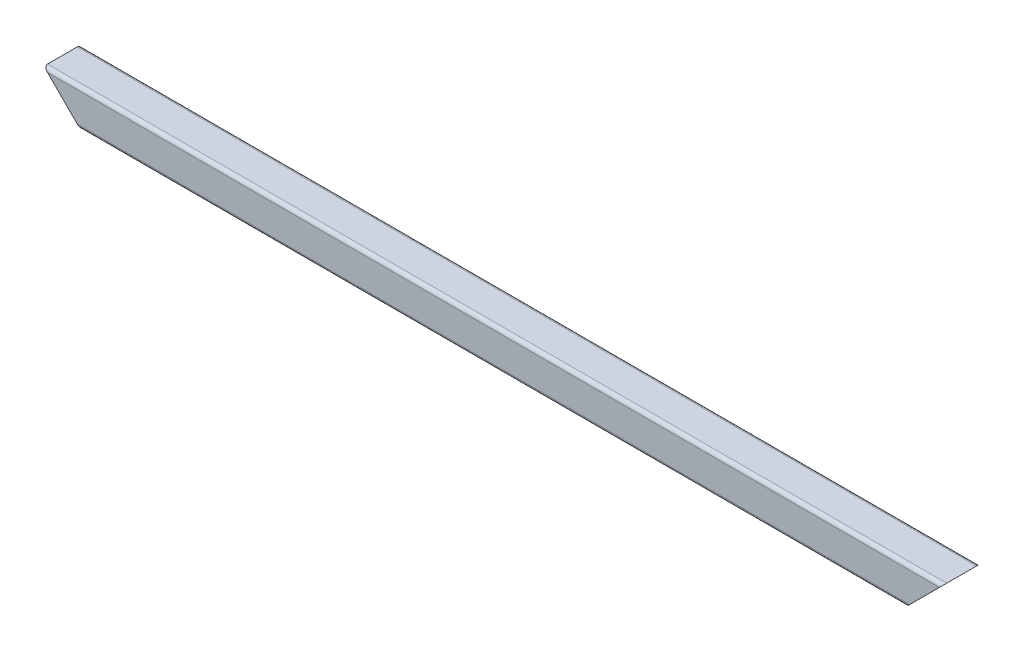
ISO-10303-21;
HEADER;
FILE_DESCRIPTION(('STEP AP214'),'2;1');
FILE_NAME('part.step','',(''),(''),'','','');
FILE_SCHEMA(('AUTOMOTIVE_DESIGN { 1 0 10303 214 1 1 1 1 }'));
ENDSEC;
DATA;
#1=APPLICATION_CONTEXT('core data for automotive mechanical design processes');
#2=APPLICATION_PROTOCOL_DEFINITION('international standard','automotive_design',2000,#1);
#3=PRODUCT_CONTEXT('',#1,'mechanical');
#4=PRODUCT('Part','Part','',(#3));
#5=PRODUCT_RELATED_PRODUCT_CATEGORY('part','',(#4));
#6=PRODUCT_DEFINITION_FORMATION('','',#4);
#7=PRODUCT_DEFINITION_CONTEXT('part definition',#1,'design');
#8=PRODUCT_DEFINITION('design','',#6,#7);
#9=PRODUCT_DEFINITION_SHAPE('','',#8);
#10=(LENGTH_UNIT() NAMED_UNIT(*) SI_UNIT(.MILLI.,.METRE.));
#11=(NAMED_UNIT(*) PLANE_ANGLE_UNIT() SI_UNIT($,.RADIAN.));
#12=(NAMED_UNIT(*) SI_UNIT($,.STERADIAN.) SOLID_ANGLE_UNIT());
#13=UNCERTAINTY_MEASURE_WITH_UNIT(LENGTH_MEASURE(1.E-05),#10,'distance_accuracy_value','');
#14=(GEOMETRIC_REPRESENTATION_CONTEXT(3) GLOBAL_UNCERTAINTY_ASSIGNED_CONTEXT((#13)) GLOBAL_UNIT_ASSIGNED_CONTEXT((#10,
#11,#12)) REPRESENTATION_CONTEXT('',''));
#15=CARTESIAN_POINT('',(0.,0.,0.));
#16=DIRECTION('',(0.,0.,1.));
#17=DIRECTION('',(1.,0.,0.));
#18=AXIS2_PLACEMENT_3D('',#15,#16,#17);
#19=CARTESIAN_POINT('',(-616.49,12.7,-12.7));
#20=DIRECTION('',(0.,0.,-1.));
#21=DIRECTION('',(0.,1.,0.));
#22=AXIS2_PLACEMENT_3D('',#19,#20,#21);
#23=PLANE('',#22);
#24=DIRECTION('',(-0.707106781186551,-0.707106781186544,0.));
#25=VECTOR('',#24,1.);
#26=CARTESIAN_POINT('',(0.,12.7,-12.7));
#27=LINE('',#26,#25);
#28=CARTESIAN_POINT('',(-2.50000000000005,10.2,-12.7));
#29=VERTEX_POINT('',#28);
#30=CARTESIAN_POINT('',(-22.9000000000002,-10.2,-12.7));
#31=VERTEX_POINT('',#30);
#32=EDGE_CURVE('E166',#29,#31,#27,.T.);
#33=ORIENTED_EDGE('',*,*,#32,.T.);
#34=DIRECTION('',(1.,0.,0.));
#35=VECTOR('',#34,1.);
#36=CARTESIAN_POINT('',(-616.49,-10.2,-12.7));
#37=LINE('',#36,#35);
#38=CARTESIAN_POINT('',(-593.59,-10.2,-12.7));
#39=VERTEX_POINT('',#38);
#40=EDGE_CURVE('E172',#31,#39,#37,.F.);
#41=ORIENTED_EDGE('',*,*,#40,.T.);
#42=DIRECTION('',(-0.707106781186552,0.707106781186543,0.));
#43=VECTOR('',#42,1.);
#44=CARTESIAN_POINT('',(-616.49,12.7,-12.7));
#45=LINE('',#44,#43);
#46=CARTESIAN_POINT('',(-613.99,10.2,-12.7));
#47=VERTEX_POINT('',#46);
#48=EDGE_CURVE('E276',#39,#47,#45,.T.);
#49=ORIENTED_EDGE('',*,*,#48,.T.);
#50=DIRECTION('',(1.,0.,0.));
#51=VECTOR('',#50,1.);
#52=CARTESIAN_POINT('',(-616.49,10.2,-12.7));
#53=LINE('',#52,#51);
#54=EDGE_CURVE('E179',#47,#29,#53,.T.);
#55=ORIENTED_EDGE('',*,*,#54,.T.);
#56=EDGE_LOOP('',(#33,#41,#49,#55));
#57=FACE_BOUND('',#56,.T.);
#58=ADVANCED_FACE('F37',(#57),#23,.T.);
#59=CARTESIAN_POINT('',(-616.49,-12.7,12.7));
#60=DIRECTION('',(0.,-1.,0.));
#61=DIRECTION('',(0.,0.,-1.));
#62=AXIS2_PLACEMENT_3D('',#59,#60,#61);
#63=PLANE('',#62);
#64=DIRECTION('',(0.,0.,1.));
#65=VECTOR('',#64,1.);
#66=CARTESIAN_POINT('',(-25.4000000000003,-12.7,-12.7));
#67=LINE('',#66,#65);
#68=CARTESIAN_POINT('',(-25.4000000000003,-12.7,-10.2));
#69=VERTEX_POINT('',#68);
#70=CARTESIAN_POINT('',(-25.4000000000003,-12.7,10.2));
#71=VERTEX_POINT('',#70);
#72=EDGE_CURVE('E302',#69,#71,#67,.T.);
#73=ORIENTED_EDGE('',*,*,#72,.T.);
#74=DIRECTION('',(1.,0.,0.));
#75=VECTOR('',#74,1.);
#76=CARTESIAN_POINT('',(-616.49,-12.7,10.2));
#77=LINE('',#76,#75);
#78=CARTESIAN_POINT('',(-591.09,-12.7,10.2));
#79=VERTEX_POINT('',#78);
#80=EDGE_CURVE('E261',#71,#79,#77,.F.);
#81=ORIENTED_EDGE('',*,*,#80,.T.);
#82=DIRECTION('',(0.,0.,1.));
#83=VECTOR('',#82,1.);
#84=CARTESIAN_POINT('',(-591.09,-12.7,-12.7));
#85=LINE('',#84,#83);
#86=CARTESIAN_POINT('',(-591.09,-12.7,-10.2));
#87=VERTEX_POINT('',#86);
#88=EDGE_CURVE('E237',#87,#79,#85,.T.);
#89=ORIENTED_EDGE('',*,*,#88,.F.);
#90=DIRECTION('',(1.,0.,0.));
#91=VECTOR('',#90,1.);
#92=CARTESIAN_POINT('',(-616.49,-12.7,-10.2));
#93=LINE('',#92,#91);
#94=EDGE_CURVE('E265',#87,#69,#93,.T.);
#95=ORIENTED_EDGE('',*,*,#94,.T.);
#96=EDGE_LOOP('',(#73,#81,#89,#95));
#97=FACE_BOUND('',#96,.T.);
#98=ADVANCED_FACE('F304',(#97),#63,.T.);
#99=CARTESIAN_POINT('',(-616.49,12.7,12.7));
#100=DIRECTION('',(0.,0.,1.));
#101=DIRECTION('',(0.,-1.,0.));
#102=AXIS2_PLACEMENT_3D('',#99,#100,#101);
#103=PLANE('',#102);
#104=DIRECTION('',(-0.707106781186551,-0.707106781186544,0.));
#105=VECTOR('',#104,1.);
#106=CARTESIAN_POINT('',(0.,12.7,12.7));
#107=LINE('',#106,#105);
#108=CARTESIAN_POINT('',(-2.50000000000005,10.2,12.7));
#109=VERTEX_POINT('',#108);
#110=CARTESIAN_POINT('',(-22.9000000000002,-10.2,12.7));
#111=VERTEX_POINT('',#110);
#112=EDGE_CURVE('E152',#109,#111,#107,.T.);
#113=ORIENTED_EDGE('',*,*,#112,.F.);
#114=DIRECTION('',(1.,0.,0.));
#115=VECTOR('',#114,1.);
#116=CARTESIAN_POINT('',(-616.49,10.2,12.7));
#117=LINE('',#116,#115);
#118=CARTESIAN_POINT('',(-613.99,10.2,12.7));
#119=VERTEX_POINT('',#118);
#120=EDGE_CURVE('E59',#109,#119,#117,.F.);
#121=ORIENTED_EDGE('',*,*,#120,.T.);
#122=DIRECTION('',(-0.707106781186552,0.707106781186543,0.));
#123=VECTOR('',#122,1.);
#124=CARTESIAN_POINT('',(-616.49,12.7,12.7));
#125=LINE('',#124,#123);
#126=CARTESIAN_POINT('',(-593.59,-10.2,12.7));
#127=VERTEX_POINT('',#126);
#128=EDGE_CURVE('E289',#127,#119,#125,.T.);
#129=ORIENTED_EDGE('',*,*,#128,.F.);
#130=DIRECTION('',(1.,0.,0.));
#131=VECTOR('',#130,1.);
#132=CARTESIAN_POINT('',(-616.49,-10.2,12.7));
#133=LINE('',#132,#131);
#134=EDGE_CURVE('E165',#127,#111,#133,.T.);
#135=ORIENTED_EDGE('',*,*,#134,.T.);
#136=EDGE_LOOP('',(#113,#121,#129,#135));
#137=FACE_BOUND('',#136,.T.);
#138=ADVANCED_FACE('F163',(#137),#103,.T.);
#139=CARTESIAN_POINT('',(-616.49,12.7,12.7));
#140=DIRECTION('',(0.,1.,0.));
#141=DIRECTION('',(0.,0.,1.));
#142=AXIS2_PLACEMENT_3D('',#139,#140,#141);
#143=PLANE('',#142);
#144=DIRECTION('',(0.,0.,1.));
#145=VECTOR('',#144,1.);
#146=CARTESIAN_POINT('',(0.,12.7,12.7));
#147=LINE('',#146,#145);
#148=CARTESIAN_POINT('',(0.,12.7,-10.2));
#149=VERTEX_POINT('',#148);
#150=CARTESIAN_POINT('',(0.,12.7,10.2));
#151=VERTEX_POINT('',#150);
#152=EDGE_CURVE('E155',#149,#151,#147,.T.);
#153=ORIENTED_EDGE('',*,*,#152,.F.);
#154=DIRECTION('',(1.,0.,0.));
#155=VECTOR('',#154,1.);
#156=CARTESIAN_POINT('',(-616.49,12.7,-10.2));
#157=LINE('',#156,#155);
#158=CARTESIAN_POINT('',(-616.49,12.7,-10.2));
#159=VERTEX_POINT('',#158);
#160=EDGE_CURVE('E184',#149,#159,#157,.F.);
#161=ORIENTED_EDGE('',*,*,#160,.T.);
#162=DIRECTION('',(0.,0.,1.));
#163=VECTOR('',#162,1.);
#164=CARTESIAN_POINT('',(-616.49,12.7,12.7));
#165=LINE('',#164,#163);
#166=CARTESIAN_POINT('',(-616.49,12.7,10.2));
#167=VERTEX_POINT('',#166);
#168=EDGE_CURVE('E258',#159,#167,#165,.T.);
#169=ORIENTED_EDGE('',*,*,#168,.T.);
#170=DIRECTION('',(1.,0.,0.));
#171=VECTOR('',#170,1.);
#172=CARTESIAN_POINT('',(-616.49,12.7,10.2));
#173=LINE('',#172,#171);
#174=EDGE_CURVE('E176',#167,#151,#173,.T.);
#175=ORIENTED_EDGE('',*,*,#174,.T.);
#176=EDGE_LOOP('',(#153,#161,#169,#175));
#177=FACE_BOUND('',#176,.T.);
#178=ADVANCED_FACE('F351',(#177),#143,.T.);
#179=CARTESIAN_POINT('',(-616.49,-9.652,-9.652));
#180=DIRECTION('',(0.,0.,-1.));
#181=DIRECTION('',(-1.,0.,0.));
#182=AXIS2_PLACEMENT_3D('',#179,#180,#181);
#183=PLANE('',#182);
#184=DIRECTION('',(1.,0.,0.));
#185=VECTOR('',#184,1.);
#186=CARTESIAN_POINT('',(0.,-8.652,-9.652));
#187=LINE('',#186,#185);
#188=CARTESIAN_POINT('',(-595.138,-8.652,-9.652));
#189=VERTEX_POINT('',#188);
#190=CARTESIAN_POINT('',(-21.3520000000001,-8.652,-9.652));
#191=VERTEX_POINT('',#190);
#192=EDGE_CURVE('E191',#189,#191,#187,.T.);
#193=ORIENTED_EDGE('',*,*,#192,.T.);
#194=DIRECTION('',(0.707106781186551,0.707106781186544,0.));
#195=VECTOR('',#194,1.);
#196=CARTESIAN_POINT('',(-319.421000000003,-306.721,-9.652));
#197=LINE('',#196,#195);
#198=CARTESIAN_POINT('',(-4.04800000000005,8.65199999999999,-9.652));
#199=VERTEX_POINT('',#198);
#200=EDGE_CURVE('E321',#191,#199,#197,.T.);
#201=ORIENTED_EDGE('',*,*,#200,.T.);
#202=DIRECTION('',(1.,0.,0.));
#203=VECTOR('',#202,1.);
#204=CARTESIAN_POINT('',(-616.49,8.652,-9.652));
#205=LINE('',#204,#203);
#206=CARTESIAN_POINT('',(-612.442,8.652,-9.652));
#207=VERTEX_POINT('',#206);
#208=EDGE_CURVE('E188',#199,#207,#205,.F.);
#209=ORIENTED_EDGE('',*,*,#208,.T.);
#210=DIRECTION('',(0.707106781186552,-0.707106781186543,0.));
#211=VECTOR('',#210,1.);
#212=CARTESIAN_POINT('',(-605.314,1.52400000000014,-9.652));
#213=LINE('',#212,#211);
#214=EDGE_CURVE('E245',#207,#189,#213,.T.);
#215=ORIENTED_EDGE('',*,*,#214,.T.);
#216=EDGE_LOOP('',(#193,#201,#209,#215));
#217=FACE_BOUND('',#216,.T.);
#218=ADVANCED_FACE('F443',(#217),#183,.F.);
#219=CARTESIAN_POINT('',(-616.49,-9.652,9.652));
#220=DIRECTION('',(0.,-1.,0.));
#221=DIRECTION('',(0.,0.,-1.));
#222=AXIS2_PLACEMENT_3D('',#219,#220,#221);
#223=PLANE('',#222);
#224=DIRECTION('',(1.,0.,0.));
#225=VECTOR('',#224,1.);
#226=CARTESIAN_POINT('',(0.,-9.652,8.652));
#227=LINE('',#226,#225);
#228=CARTESIAN_POINT('',(-594.138,-9.652,8.652));
#229=VERTEX_POINT('',#228);
#230=CARTESIAN_POINT('',(-22.3520000000002,-9.652,8.652));
#231=VERTEX_POINT('',#230);
#232=EDGE_CURVE('E195',#229,#231,#227,.T.);
#233=ORIENTED_EDGE('',*,*,#232,.T.);
#234=DIRECTION('',(0.,0.,-1.));
#235=VECTOR('',#234,1.);
#236=CARTESIAN_POINT('',(-22.3520000000003,-9.652,9.652));
#237=LINE('',#236,#235);
#238=CARTESIAN_POINT('',(-22.3520000000003,-9.652,-8.652));
#239=VERTEX_POINT('',#238);
#240=EDGE_CURVE('E52',#231,#239,#237,.T.);
#241=ORIENTED_EDGE('',*,*,#240,.T.);
#242=DIRECTION('',(1.,0.,0.));
#243=VECTOR('',#242,1.);
#244=CARTESIAN_POINT('',(-616.49,-9.652,-8.652));
#245=LINE('',#244,#243);
#246=CARTESIAN_POINT('',(-594.138,-9.652,-8.652));
#247=VERTEX_POINT('',#246);
#248=EDGE_CURVE('E199',#239,#247,#245,.F.);
#249=ORIENTED_EDGE('',*,*,#248,.T.);
#250=DIRECTION('',(0.,0.,1.));
#251=VECTOR('',#250,1.);
#252=CARTESIAN_POINT('',(-594.138,-9.652,9.652));
#253=LINE('',#252,#251);
#254=EDGE_CURVE('E225',#247,#229,#253,.T.);
#255=ORIENTED_EDGE('',*,*,#254,.T.);
#256=EDGE_LOOP('',(#233,#241,#249,#255));
#257=FACE_BOUND('',#256,.T.);
#258=ADVANCED_FACE('F230',(#257),#223,.F.);
#259=CARTESIAN_POINT('',(-616.49,-9.652,9.652));
#260=DIRECTION('',(0.,0.,1.));
#261=DIRECTION('',(1.,0.,0.));
#262=AXIS2_PLACEMENT_3D('',#259,#260,#261);
#263=PLANE('',#262);
#264=DIRECTION('',(1.,0.,0.));
#265=VECTOR('',#264,1.);
#266=CARTESIAN_POINT('',(0.,8.652,9.652));
#267=LINE('',#266,#265);
#268=CARTESIAN_POINT('',(-612.442,8.652,9.652));
#269=VERTEX_POINT('',#268);
#270=CARTESIAN_POINT('',(-4.04800000000005,8.65199999999999,9.652));
#271=VERTEX_POINT('',#270);
#272=EDGE_CURVE('E212',#269,#271,#267,.T.);
#273=ORIENTED_EDGE('',*,*,#272,.T.);
#274=DIRECTION('',(-0.707106781186551,-0.707106781186544,0.));
#275=VECTOR('',#274,1.);
#276=CARTESIAN_POINT('',(-319.421000000003,-306.721,9.652));
#277=LINE('',#276,#275);
#278=CARTESIAN_POINT('',(-21.3520000000001,-8.652,9.652));
#279=VERTEX_POINT('',#278);
#280=EDGE_CURVE('E305',#271,#279,#277,.T.);
#281=ORIENTED_EDGE('',*,*,#280,.T.);
#282=DIRECTION('',(1.,0.,0.));
#283=VECTOR('',#282,1.);
#284=CARTESIAN_POINT('',(-616.49,-8.652,9.652));
#285=LINE('',#284,#283);
#286=CARTESIAN_POINT('',(-595.138,-8.652,9.652));
#287=VERTEX_POINT('',#286);
#288=EDGE_CURVE('E209',#279,#287,#285,.F.);
#289=ORIENTED_EDGE('',*,*,#288,.T.);
#290=DIRECTION('',(-0.707106781186552,0.707106781186543,0.));
#291=VECTOR('',#290,1.);
#292=CARTESIAN_POINT('',(-605.314,1.52400000000014,9.652));
#293=LINE('',#292,#291);
#294=EDGE_CURVE('E228',#287,#269,#293,.T.);
#295=ORIENTED_EDGE('',*,*,#294,.T.);
#296=EDGE_LOOP('',(#273,#281,#289,#295));
#297=FACE_BOUND('',#296,.T.);
#298=ADVANCED_FACE('F336',(#297),#263,.F.);
#299=CARTESIAN_POINT('',(-616.49,9.652,9.652));
#300=DIRECTION('',(0.,1.,0.));
#301=DIRECTION('',(0.,0.,1.));
#302=AXIS2_PLACEMENT_3D('',#299,#300,#301);
#303=PLANE('',#302);
#304=DIRECTION('',(1.,0.,0.));
#305=VECTOR('',#304,1.);
#306=CARTESIAN_POINT('',(0.,9.652,-8.652));
#307=LINE('',#306,#305);
#308=CARTESIAN_POINT('',(-613.442,9.652,-8.652));
#309=VERTEX_POINT('',#308);
#310=CARTESIAN_POINT('',(-3.04800000000005,9.652,-8.652));
#311=VERTEX_POINT('',#310);
#312=EDGE_CURVE('E205',#309,#311,#307,.T.);
#313=ORIENTED_EDGE('',*,*,#312,.T.);
#314=DIRECTION('',(0.,0.,1.));
#315=VECTOR('',#314,1.);
#316=CARTESIAN_POINT('',(-3.04800000000005,9.652,9.652));
#317=LINE('',#316,#315);
#318=CARTESIAN_POINT('',(-3.04799999999994,9.652,8.652));
#319=VERTEX_POINT('',#318);
#320=EDGE_CURVE('E318',#311,#319,#317,.T.);
#321=ORIENTED_EDGE('',*,*,#320,.T.);
#322=DIRECTION('',(1.,0.,0.));
#323=VECTOR('',#322,1.);
#324=CARTESIAN_POINT('',(-616.49,9.652,8.652));
#325=LINE('',#324,#323);
#326=CARTESIAN_POINT('',(-613.442,9.652,8.652));
#327=VERTEX_POINT('',#326);
#328=EDGE_CURVE('E202',#319,#327,#325,.F.);
#329=ORIENTED_EDGE('',*,*,#328,.T.);
#330=DIRECTION('',(0.,0.,-1.));
#331=VECTOR('',#330,1.);
#332=CARTESIAN_POINT('',(-613.442,9.652,9.652));
#333=LINE('',#332,#331);
#334=EDGE_CURVE('E242',#327,#309,#333,.T.);
#335=ORIENTED_EDGE('',*,*,#334,.T.);
#336=EDGE_LOOP('',(#313,#321,#329,#335));
#337=FACE_BOUND('',#336,.T.);
#338=ADVANCED_FACE('F329',(#337),#303,.F.);
#339=CARTESIAN_POINT('',(-616.49,-10.2,-10.2));
#340=DIRECTION('',(1.,0.,0.));
#341=DIRECTION('',(0.,0.,-1.));
#342=AXIS2_PLACEMENT_3D('',#339,#340,#341);
#343=CYLINDRICAL_SURFACE('',#342,2.5);
#344=CARTESIAN_POINT('',(-22.9000000000003,-10.2,-10.2));
#345=DIRECTION('',(-0.707106781186544,0.707106781186551,0.));
#346=DIRECTION('',(0.707106781186551,0.707106781186544,0.));
#347=AXIS2_PLACEMENT_3D('',#344,#345,#346);
#348=ELLIPSE('',#347,3.53553390593276,2.5);
#349=EDGE_CURVE('E284',#69,#31,#348,.F.);
#350=ORIENTED_EDGE('',*,*,#349,.F.);
#351=ORIENTED_EDGE('',*,*,#94,.F.);
#352=CARTESIAN_POINT('',(-593.59,-10.2,-10.2));
#353=DIRECTION('',(0.707106781186543,0.707106781186552,0.));
#354=DIRECTION('',(0.707106781186552,-0.707106781186543,0.));
#355=AXIS2_PLACEMENT_3D('',#352,#353,#354);
#356=ELLIPSE('',#355,3.53553390593276,2.5);
#357=EDGE_CURVE('E256',#39,#87,#356,.F.);
#358=ORIENTED_EDGE('',*,*,#357,.F.);
#359=ORIENTED_EDGE('',*,*,#40,.F.);
#360=EDGE_LOOP('',(#350,#351,#358,#359));
#361=FACE_BOUND('',#360,.T.);
#362=ADVANCED_FACE('F353',(#361),#343,.T.);
#363=CARTESIAN_POINT('',(-616.49,-10.2,10.2));
#364=DIRECTION('',(1.,0.,0.));
#365=DIRECTION('',(0.,0.,-1.));
#366=AXIS2_PLACEMENT_3D('',#363,#364,#365);
#367=CYLINDRICAL_SURFACE('',#366,2.5);
#368=CARTESIAN_POINT('',(-22.9000000000003,-10.2,10.2));
#369=DIRECTION('',(-0.707106781186544,0.707106781186551,0.));
#370=DIRECTION('',(0.707106781186551,0.707106781186544,0.));
#371=AXIS2_PLACEMENT_3D('',#368,#369,#370);
#372=ELLIPSE('',#371,3.53553390593276,2.5);
#373=EDGE_CURVE('E282',#111,#71,#372,.F.);
#374=ORIENTED_EDGE('',*,*,#373,.F.);
#375=ORIENTED_EDGE('',*,*,#134,.F.);
#376=CARTESIAN_POINT('',(-593.59,-10.2,10.2));
#377=DIRECTION('',(0.707106781186543,0.707106781186552,0.));
#378=DIRECTION('',(0.707106781186552,-0.707106781186543,0.));
#379=AXIS2_PLACEMENT_3D('',#376,#377,#378);
#380=ELLIPSE('',#379,3.53553390593276,2.5);
#381=EDGE_CURVE('E254',#79,#127,#380,.F.);
#382=ORIENTED_EDGE('',*,*,#381,.F.);
#383=ORIENTED_EDGE('',*,*,#80,.F.);
#384=EDGE_LOOP('',(#374,#375,#382,#383));
#385=FACE_BOUND('',#384,.T.);
#386=ADVANCED_FACE('F300',(#385),#367,.T.);
#387=CARTESIAN_POINT('',(-616.49,10.2,-10.2));
#388=DIRECTION('',(1.,0.,0.));
#389=DIRECTION('',(0.,0.,-1.));
#390=AXIS2_PLACEMENT_3D('',#387,#388,#389);
#391=CYLINDRICAL_SURFACE('',#390,2.5);
#392=CARTESIAN_POINT('',(-2.49999999999995,10.2,-10.2));
#393=DIRECTION('',(-0.707106781186544,0.707106781186551,0.));
#394=DIRECTION('',(0.707106781186551,0.707106781186544,0.));
#395=AXIS2_PLACEMENT_3D('',#392,#393,#394);
#396=ELLIPSE('',#395,3.53553390593276,2.5);
#397=EDGE_CURVE('E159',#29,#149,#396,.F.);
#398=ORIENTED_EDGE('',*,*,#397,.F.);
#399=ORIENTED_EDGE('',*,*,#54,.F.);
#400=CARTESIAN_POINT('',(-613.99,10.2,-10.2));
#401=DIRECTION('',(0.707106781186543,0.707106781186552,0.));
#402=DIRECTION('',(0.707106781186552,-0.707106781186543,0.));
#403=AXIS2_PLACEMENT_3D('',#400,#401,#402);
#404=ELLIPSE('',#403,3.53553390593276,2.5);
#405=EDGE_CURVE('E252',#159,#47,#404,.F.);
#406=ORIENTED_EDGE('',*,*,#405,.F.);
#407=ORIENTED_EDGE('',*,*,#160,.F.);
#408=EDGE_LOOP('',(#398,#399,#406,#407));
#409=FACE_BOUND('',#408,.T.);
#410=ADVANCED_FACE('F280',(#409),#391,.T.);
#411=CARTESIAN_POINT('',(-616.49,10.2,10.2));
#412=DIRECTION('',(1.,0.,0.));
#413=DIRECTION('',(0.,0.,-1.));
#414=AXIS2_PLACEMENT_3D('',#411,#412,#413);
#415=CYLINDRICAL_SURFACE('',#414,2.5);
#416=CARTESIAN_POINT('',(-2.49999999999995,10.2,10.2));
#417=DIRECTION('',(-0.707106781186544,0.707106781186551,0.));
#418=DIRECTION('',(0.707106781186551,0.707106781186544,0.));
#419=AXIS2_PLACEMENT_3D('',#416,#417,#418);
#420=ELLIPSE('',#419,3.53553390593276,2.5);
#421=EDGE_CURVE('E150',#151,#109,#420,.F.);
#422=ORIENTED_EDGE('',*,*,#421,.F.);
#423=ORIENTED_EDGE('',*,*,#174,.F.);
#424=CARTESIAN_POINT('',(-613.99,10.2,10.2));
#425=DIRECTION('',(0.707106781186543,0.707106781186552,0.));
#426=DIRECTION('',(0.707106781186552,-0.707106781186543,0.));
#427=AXIS2_PLACEMENT_3D('',#424,#425,#426);
#428=ELLIPSE('',#427,3.53553390593276,2.5);
#429=EDGE_CURVE('E170',#119,#167,#428,.F.);
#430=ORIENTED_EDGE('',*,*,#429,.F.);
#431=ORIENTED_EDGE('',*,*,#120,.F.);
#432=EDGE_LOOP('',(#422,#423,#430,#431));
#433=FACE_BOUND('',#432,.T.);
#434=ADVANCED_FACE('F169',(#433),#415,.T.);
#435=CARTESIAN_POINT('',(-616.49,-8.652,-8.652));
#436=DIRECTION('',(-1.,0.,0.));
#437=DIRECTION('',(0.,0.,1.));
#438=AXIS2_PLACEMENT_3D('',#435,#436,#437);
#439=CYLINDRICAL_SURFACE('',#438,1.);
#440=ORIENTED_EDGE('',*,*,#248,.F.);
#441=CARTESIAN_POINT('',(-21.3520000000001,-8.652,-8.652));
#442=DIRECTION('',(-0.707106781186544,0.707106781186551,0.));
#443=DIRECTION('',(-0.707106781186551,-0.707106781186544,0.));
#444=AXIS2_PLACEMENT_3D('',#441,#442,#443);
#445=ELLIPSE('',#444,1.4142135623731,1.);
#446=EDGE_CURVE('E315',#239,#191,#445,.F.);
#447=ORIENTED_EDGE('',*,*,#446,.T.);
#448=ORIENTED_EDGE('',*,*,#192,.F.);
#449=CARTESIAN_POINT('',(-595.138,-8.652,-8.652));
#450=DIRECTION('',(0.707106781186543,0.707106781186552,0.));
#451=DIRECTION('',(-0.707106781186552,0.707106781186543,0.));
#452=AXIS2_PLACEMENT_3D('',#449,#450,#451);
#453=ELLIPSE('',#452,1.4142135623731,1.);
#454=EDGE_CURVE('E235',#189,#247,#453,.F.);
#455=ORIENTED_EDGE('',*,*,#454,.T.);
#456=EDGE_LOOP('',(#440,#447,#448,#455));
#457=FACE_BOUND('',#456,.T.);
#458=ADVANCED_FACE('F363',(#457),#439,.F.);
#459=CARTESIAN_POINT('',(-616.49,8.652,-8.652));
#460=DIRECTION('',(-1.,0.,0.));
#461=DIRECTION('',(0.,0.,1.));
#462=AXIS2_PLACEMENT_3D('',#459,#460,#461);
#463=CYLINDRICAL_SURFACE('',#462,1.);
#464=ORIENTED_EDGE('',*,*,#208,.F.);
#465=CARTESIAN_POINT('',(-4.04800000000005,8.652,-8.652));
#466=DIRECTION('',(-0.707106781186544,0.707106781186551,0.));
#467=DIRECTION('',(-0.707106781186551,-0.707106781186544,0.));
#468=AXIS2_PLACEMENT_3D('',#465,#466,#467);
#469=ELLIPSE('',#468,1.4142135623731,1.);
#470=EDGE_CURVE('E160',#199,#311,#469,.F.);
#471=ORIENTED_EDGE('',*,*,#470,.T.);
#472=ORIENTED_EDGE('',*,*,#312,.F.);
#473=CARTESIAN_POINT('',(-612.442,8.652,-8.652));
#474=DIRECTION('',(0.707106781186543,0.707106781186552,0.));
#475=DIRECTION('',(-0.707106781186552,0.707106781186543,0.));
#476=AXIS2_PLACEMENT_3D('',#473,#474,#475);
#477=ELLIPSE('',#476,1.4142135623731,1.);
#478=EDGE_CURVE('E248',#309,#207,#477,.F.);
#479=ORIENTED_EDGE('',*,*,#478,.T.);
#480=EDGE_LOOP('',(#464,#471,#472,#479));
#481=FACE_BOUND('',#480,.T.);
#482=ADVANCED_FACE('F327',(#481),#463,.F.);
#483=CARTESIAN_POINT('',(-616.49,8.652,8.652));
#484=DIRECTION('',(-1.,0.,0.));
#485=DIRECTION('',(0.,0.,1.));
#486=AXIS2_PLACEMENT_3D('',#483,#484,#485);
#487=CYLINDRICAL_SURFACE('',#486,1.);
#488=ORIENTED_EDGE('',*,*,#328,.F.);
#489=CARTESIAN_POINT('',(-4.04800000000005,8.652,8.652));
#490=DIRECTION('',(-0.707106781186544,0.707106781186551,0.));
#491=DIRECTION('',(-0.707106781186551,-0.707106781186544,0.));
#492=AXIS2_PLACEMENT_3D('',#489,#490,#491);
#493=ELLIPSE('',#492,1.4142135623731,1.);
#494=EDGE_CURVE('E312',#319,#271,#493,.F.);
#495=ORIENTED_EDGE('',*,*,#494,.T.);
#496=ORIENTED_EDGE('',*,*,#272,.F.);
#497=CARTESIAN_POINT('',(-612.442,8.652,8.652));
#498=DIRECTION('',(0.707106781186543,0.707106781186552,0.));
#499=DIRECTION('',(-0.707106781186552,0.707106781186543,0.));
#500=AXIS2_PLACEMENT_3D('',#497,#498,#499);
#501=ELLIPSE('',#500,1.4142135623731,1.);
#502=EDGE_CURVE('E232',#269,#327,#501,.F.);
#503=ORIENTED_EDGE('',*,*,#502,.T.);
#504=EDGE_LOOP('',(#488,#495,#496,#503));
#505=FACE_BOUND('',#504,.T.);
#506=ADVANCED_FACE('F334',(#505),#487,.F.);
#507=CARTESIAN_POINT('',(-616.49,-8.652,8.652));
#508=DIRECTION('',(-1.,0.,0.));
#509=DIRECTION('',(0.,0.,1.));
#510=AXIS2_PLACEMENT_3D('',#507,#508,#509);
#511=CYLINDRICAL_SURFACE('',#510,1.);
#512=ORIENTED_EDGE('',*,*,#288,.F.);
#513=CARTESIAN_POINT('',(-21.3520000000001,-8.652,8.652));
#514=DIRECTION('',(-0.707106781186544,0.707106781186551,0.));
#515=DIRECTION('',(-0.707106781186551,-0.707106781186544,0.));
#516=AXIS2_PLACEMENT_3D('',#513,#514,#515);
#517=ELLIPSE('',#516,1.4142135623731,1.);
#518=EDGE_CURVE('E11',#279,#231,#517,.F.);
#519=ORIENTED_EDGE('',*,*,#518,.T.);
#520=ORIENTED_EDGE('',*,*,#232,.F.);
#521=CARTESIAN_POINT('',(-595.138,-8.652,8.652));
#522=DIRECTION('',(0.707106781186543,0.707106781186552,0.));
#523=DIRECTION('',(-0.707106781186552,0.707106781186543,0.));
#524=AXIS2_PLACEMENT_3D('',#521,#522,#523);
#525=ELLIPSE('',#524,1.4142135623731,1.);
#526=EDGE_CURVE('E45',#229,#287,#525,.F.);
#527=ORIENTED_EDGE('',*,*,#526,.T.);
#528=EDGE_LOOP('',(#512,#519,#520,#527));
#529=FACE_BOUND('',#528,.T.);
#530=ADVANCED_FACE('F39',(#529),#511,.F.);
#531=CARTESIAN_POINT('',(-616.49,12.7,-12.7));
#532=DIRECTION('',(0.707106781186543,0.707106781186552,0.));
#533=DIRECTION('',(-0.707106781186552,0.707106781186543,0.));
#534=AXIS2_PLACEMENT_3D('',#531,#532,#533);
#535=PLANE('',#534);
#536=ORIENTED_EDGE('',*,*,#357,.T.);
#537=ORIENTED_EDGE('',*,*,#88,.T.);
#538=ORIENTED_EDGE('',*,*,#381,.T.);
#539=ORIENTED_EDGE('',*,*,#128,.T.);
#540=ORIENTED_EDGE('',*,*,#429,.T.);
#541=ORIENTED_EDGE('',*,*,#168,.F.);
#542=ORIENTED_EDGE('',*,*,#405,.T.);
#543=ORIENTED_EDGE('',*,*,#48,.F.);
#544=EDGE_LOOP('',(#536,#537,#538,#539,#540,#541,#542,#543));
#545=FACE_BOUND('',#544,.T.);
#546=ORIENTED_EDGE('',*,*,#334,.F.);
#547=ORIENTED_EDGE('',*,*,#502,.F.);
#548=ORIENTED_EDGE('',*,*,#294,.F.);
#549=ORIENTED_EDGE('',*,*,#526,.F.);
#550=ORIENTED_EDGE('',*,*,#254,.F.);
#551=ORIENTED_EDGE('',*,*,#454,.F.);
#552=ORIENTED_EDGE('',*,*,#214,.F.);
#553=ORIENTED_EDGE('',*,*,#478,.F.);
#554=EDGE_LOOP('',(#546,#547,#548,#549,#550,#551,#552,#553));
#555=FACE_BOUND('',#554,.T.);
#556=ADVANCED_FACE('F224',(#545,#555),#535,.F.);
#557=CARTESIAN_POINT('',(0.,12.7,-12.7));
#558=DIRECTION('',(-0.707106781186544,0.707106781186551,0.));
#559=DIRECTION('',(-0.707106781186551,-0.707106781186544,0.));
#560=AXIS2_PLACEMENT_3D('',#557,#558,#559);
#561=PLANE('',#560);
#562=ORIENTED_EDGE('',*,*,#349,.T.);
#563=ORIENTED_EDGE('',*,*,#32,.F.);
#564=ORIENTED_EDGE('',*,*,#397,.T.);
#565=ORIENTED_EDGE('',*,*,#152,.T.);
#566=ORIENTED_EDGE('',*,*,#421,.T.);
#567=ORIENTED_EDGE('',*,*,#112,.T.);
#568=ORIENTED_EDGE('',*,*,#373,.T.);
#569=ORIENTED_EDGE('',*,*,#72,.F.);
#570=EDGE_LOOP('',(#562,#563,#564,#565,#566,#567,#568,#569));
#571=FACE_BOUND('',#570,.T.);
#572=ORIENTED_EDGE('',*,*,#200,.F.);
#573=ORIENTED_EDGE('',*,*,#446,.F.);
#574=ORIENTED_EDGE('',*,*,#240,.F.);
#575=ORIENTED_EDGE('',*,*,#518,.F.);
#576=ORIENTED_EDGE('',*,*,#280,.F.);
#577=ORIENTED_EDGE('',*,*,#494,.F.);
#578=ORIENTED_EDGE('',*,*,#320,.F.);
#579=ORIENTED_EDGE('',*,*,#470,.F.);
#580=EDGE_LOOP('',(#572,#573,#574,#575,#576,#577,#578,#579));
#581=FACE_BOUND('',#580,.T.);
#582=ADVANCED_FACE('F151',(#571,#581),#561,.F.);
#583=CLOSED_SHELL('',(#58,#98,#138,#178,#218,#258,#298,#338,#362,#386,#410,#434,#458,#482,#506,
#530,#556,#582));
#584=MANIFOLD_SOLID_BREP('B2',#583);
#585=ADVANCED_BREP_SHAPE_REPRESENTATION('',(#18,#584),#14);
#586=SHAPE_DEFINITION_REPRESENTATION(#9,#585);
ENDSEC;
END-ISO-10303-21;
